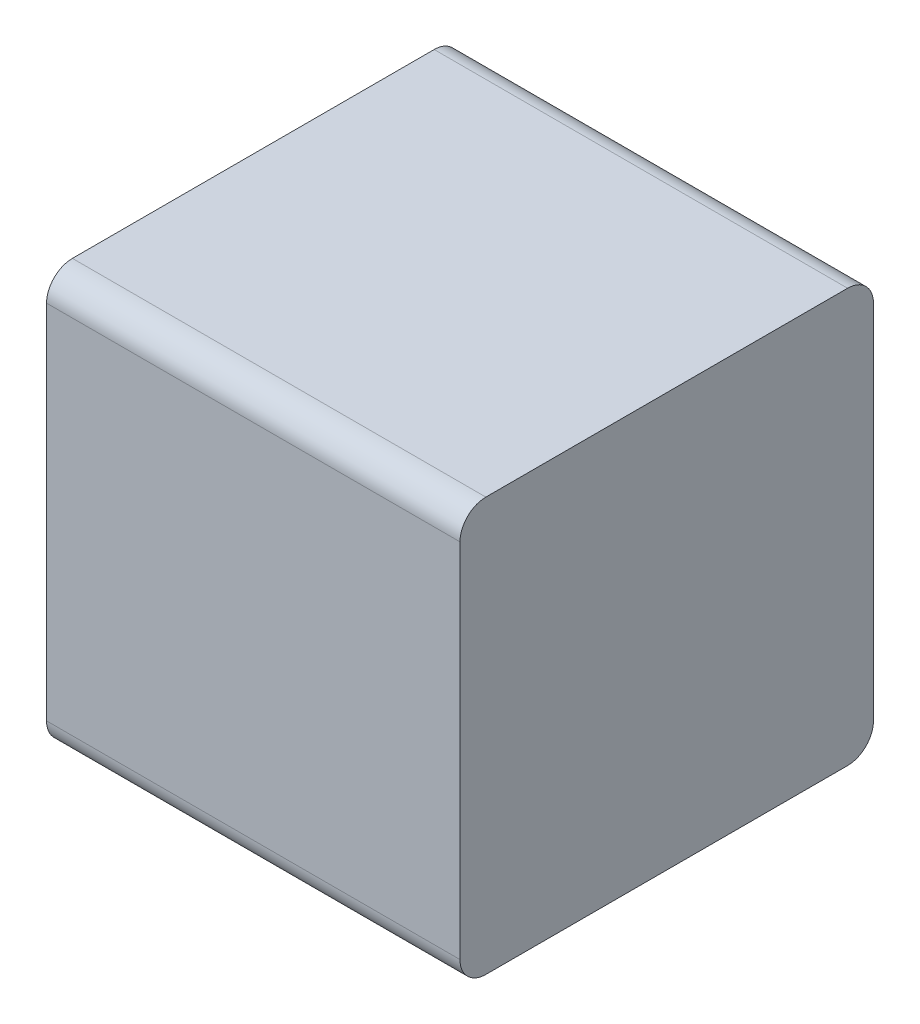
ISO-10303-21;
HEADER;
FILE_DESCRIPTION(('STEP AP214'),'2;1');
FILE_NAME('part.step','',(''),(''),'','','');
FILE_SCHEMA(('AUTOMOTIVE_DESIGN { 1 0 10303 214 1 1 1 1 }'));
ENDSEC;
DATA;
#1=APPLICATION_CONTEXT('core data for automotive mechanical design processes');
#2=APPLICATION_PROTOCOL_DEFINITION('international standard','automotive_design',2000,#1);
#3=PRODUCT_CONTEXT('',#1,'mechanical');
#4=PRODUCT('Part','Part','',(#3));
#5=PRODUCT_RELATED_PRODUCT_CATEGORY('part','',(#4));
#6=PRODUCT_DEFINITION_FORMATION('','',#4);
#7=PRODUCT_DEFINITION_CONTEXT('part definition',#1,'design');
#8=PRODUCT_DEFINITION('design','',#6,#7);
#9=PRODUCT_DEFINITION_SHAPE('','',#8);
#10=(LENGTH_UNIT() NAMED_UNIT(*) SI_UNIT(.MILLI.,.METRE.));
#11=(NAMED_UNIT(*) PLANE_ANGLE_UNIT() SI_UNIT($,.RADIAN.));
#12=(NAMED_UNIT(*) SI_UNIT($,.STERADIAN.) SOLID_ANGLE_UNIT());
#13=UNCERTAINTY_MEASURE_WITH_UNIT(LENGTH_MEASURE(1.E-05),#10,'distance_accuracy_value','');
#14=(GEOMETRIC_REPRESENTATION_CONTEXT(3) GLOBAL_UNCERTAINTY_ASSIGNED_CONTEXT((#13)) GLOBAL_UNIT_ASSIGNED_CONTEXT((#10,
#11,#12)) REPRESENTATION_CONTEXT('',''));
#15=CARTESIAN_POINT('',(0.,0.,0.));
#16=DIRECTION('',(0.,0.,1.));
#17=DIRECTION('',(1.,0.,0.));
#18=AXIS2_PLACEMENT_3D('',#15,#16,#17);
#19=CARTESIAN_POINT('',(0.,0.,0.));
#20=DIRECTION('',(0.,1.,0.));
#21=DIRECTION('',(1.,0.,0.));
#22=AXIS2_PLACEMENT_3D('',#19,#20,#21);
#23=PLANE('',#22);
#24=DIRECTION('',(0.,0.,1.));
#25=VECTOR('',#24,1.);
#26=CARTESIAN_POINT('',(1.2,0.,0.));
#27=LINE('',#26,#25);
#28=CARTESIAN_POINT('',(1.2,0.,0.05));
#29=VERTEX_POINT('',#28);
#30=CARTESIAN_POINT('',(1.2,0.,0.75));
#31=VERTEX_POINT('',#30);
#32=EDGE_CURVE('E11',#29,#31,#27,.T.);
#33=ORIENTED_EDGE('',*,*,#32,.T.);
#34=DIRECTION('',(1.,0.,0.));
#35=VECTOR('',#34,1.);
#36=CARTESIAN_POINT('',(0.,0.,0.75));
#37=LINE('',#36,#35);
#38=CARTESIAN_POINT('',(0.4,0.,0.75));
#39=VERTEX_POINT('',#38);
#40=EDGE_CURVE('E42',#39,#31,#37,.T.);
#41=ORIENTED_EDGE('',*,*,#40,.F.);
#42=DIRECTION('',(0.,0.,1.));
#43=VECTOR('',#42,1.);
#44=CARTESIAN_POINT('',(0.4,0.,0.));
#45=LINE('',#44,#43);
#46=CARTESIAN_POINT('',(0.4,0.,0.05));
#47=VERTEX_POINT('',#46);
#48=EDGE_CURVE('E156',#47,#39,#45,.T.);
#49=ORIENTED_EDGE('',*,*,#48,.F.);
#50=DIRECTION('',(1.,0.,0.));
#51=VECTOR('',#50,1.);
#52=CARTESIAN_POINT('',(0.,0.,0.05));
#53=LINE('',#52,#51);
#54=EDGE_CURVE('E28',#47,#29,#53,.T.);
#55=ORIENTED_EDGE('',*,*,#54,.T.);
#56=EDGE_LOOP('',(#33,#41,#49,#55));
#57=FACE_BOUND('',#56,.T.);
#58=ADVANCED_FACE('F17',(#57),#23,.F.);
#59=CARTESIAN_POINT('',(0.,0.05,0.05));
#60=DIRECTION('',(1.,0.,0.));
#61=DIRECTION('',(0.,-1.,0.));
#62=AXIS2_PLACEMENT_3D('',#59,#60,#61);
#63=CYLINDRICAL_SURFACE('',#62,0.05);
#64=ORIENTED_EDGE('',*,*,#54,.F.);
#65=CARTESIAN_POINT('',(0.4,0.05,0.05));
#66=DIRECTION('',(1.,0.,0.));
#67=DIRECTION('',(0.,-1.,0.));
#68=AXIS2_PLACEMENT_3D('',#65,#66,#67);
#69=CIRCLE('',#68,0.05);
#70=CARTESIAN_POINT('',(0.4,0.05,0.));
#71=VERTEX_POINT('',#70);
#72=EDGE_CURVE('E151',#47,#71,#69,.T.);
#73=ORIENTED_EDGE('',*,*,#72,.T.);
#74=DIRECTION('',(1.,0.,0.));
#75=VECTOR('',#74,1.);
#76=CARTESIAN_POINT('',(0.,0.05,0.));
#77=LINE('',#76,#75);
#78=CARTESIAN_POINT('',(1.2,0.05,0.));
#79=VERTEX_POINT('',#78);
#80=EDGE_CURVE('E168',#71,#79,#77,.T.);
#81=ORIENTED_EDGE('',*,*,#80,.T.);
#82=CARTESIAN_POINT('',(1.2,0.05,0.05));
#83=DIRECTION('',(1.,0.,0.));
#84=DIRECTION('',(0.,-1.,0.));
#85=AXIS2_PLACEMENT_3D('',#82,#83,#84);
#86=CIRCLE('',#85,0.05);
#87=EDGE_CURVE('E147',#29,#79,#86,.T.);
#88=ORIENTED_EDGE('',*,*,#87,.F.);
#89=EDGE_LOOP('',(#64,#73,#81,#88));
#90=FACE_BOUND('',#89,.T.);
#91=ADVANCED_FACE('F199',(#90),#63,.T.);
#92=CARTESIAN_POINT('',(1.2,0.,0.));
#93=DIRECTION('',(1.,0.,0.));
#94=DIRECTION('',(0.,1.,0.));
#95=AXIS2_PLACEMENT_3D('',#92,#93,#94);
#96=PLANE('',#95);
#97=ORIENTED_EDGE('',*,*,#32,.F.);
#98=ORIENTED_EDGE('',*,*,#87,.T.);
#99=DIRECTION('',(0.,1.,0.));
#100=VECTOR('',#99,1.);
#101=CARTESIAN_POINT('',(1.2,0.,0.));
#102=LINE('',#101,#100);
#103=CARTESIAN_POINT('',(1.2,0.75,0.));
#104=VERTEX_POINT('',#103);
#105=EDGE_CURVE('E143',#79,#104,#102,.T.);
#106=ORIENTED_EDGE('',*,*,#105,.T.);
#107=CARTESIAN_POINT('',(1.2,0.75,0.05));
#108=DIRECTION('',(1.,0.,0.));
#109=DIRECTION('',(0.,1.,0.));
#110=AXIS2_PLACEMENT_3D('',#107,#108,#109);
#111=CIRCLE('',#110,0.05);
#112=CARTESIAN_POINT('',(1.2,0.8,0.05));
#113=VERTEX_POINT('',#112);
#114=EDGE_CURVE('E148',#104,#113,#111,.T.);
#115=ORIENTED_EDGE('',*,*,#114,.T.);
#116=DIRECTION('',(0.,0.,1.));
#117=VECTOR('',#116,1.);
#118=CARTESIAN_POINT('',(1.2,0.8,0.));
#119=LINE('',#118,#117);
#120=CARTESIAN_POINT('',(1.2,0.8,0.75));
#121=VERTEX_POINT('',#120);
#122=EDGE_CURVE('E121',#113,#121,#119,.T.);
#123=ORIENTED_EDGE('',*,*,#122,.T.);
#124=CARTESIAN_POINT('',(1.2,0.75,0.75));
#125=DIRECTION('',(1.,0.,0.));
#126=DIRECTION('',(0.,1.,0.));
#127=AXIS2_PLACEMENT_3D('',#124,#125,#126);
#128=CIRCLE('',#127,0.05);
#129=CARTESIAN_POINT('',(1.2,0.75,0.8));
#130=VERTEX_POINT('',#129);
#131=EDGE_CURVE('E117',#121,#130,#128,.T.);
#132=ORIENTED_EDGE('',*,*,#131,.T.);
#133=DIRECTION('',(0.,1.,0.));
#134=VECTOR('',#133,1.);
#135=CARTESIAN_POINT('',(1.2,0.,0.8));
#136=LINE('',#135,#134);
#137=CARTESIAN_POINT('',(1.2,0.05,0.8));
#138=VERTEX_POINT('',#137);
#139=EDGE_CURVE('E108',#138,#130,#136,.T.);
#140=ORIENTED_EDGE('',*,*,#139,.F.);
#141=CARTESIAN_POINT('',(1.2,0.05,0.75));
#142=DIRECTION('',(1.,0.,0.));
#143=DIRECTION('',(0.,-1.,0.));
#144=AXIS2_PLACEMENT_3D('',#141,#142,#143);
#145=CIRCLE('',#144,0.05);
#146=EDGE_CURVE('E124',#138,#31,#145,.T.);
#147=ORIENTED_EDGE('',*,*,#146,.T.);
#148=EDGE_LOOP('',(#97,#98,#106,#115,#123,#132,#140,#147));
#149=FACE_BOUND('',#148,.T.);
#150=ADVANCED_FACE('F119',(#149),#96,.T.);
#151=CARTESIAN_POINT('',(0.,0.05,0.75));
#152=DIRECTION('',(1.,0.,0.));
#153=DIRECTION('',(0.,-1.,0.));
#154=AXIS2_PLACEMENT_3D('',#151,#152,#153);
#155=CYLINDRICAL_SURFACE('',#154,0.05);
#156=ORIENTED_EDGE('',*,*,#40,.T.);
#157=ORIENTED_EDGE('',*,*,#146,.F.);
#158=DIRECTION('',(1.,0.,0.));
#159=VECTOR('',#158,1.);
#160=CARTESIAN_POINT('',(0.,0.05,0.8));
#161=LINE('',#160,#159);
#162=CARTESIAN_POINT('',(0.4,0.05,0.8));
#163=VERTEX_POINT('',#162);
#164=EDGE_CURVE('E21',#163,#138,#161,.T.);
#165=ORIENTED_EDGE('',*,*,#164,.F.);
#166=CARTESIAN_POINT('',(0.4,0.05,0.75));
#167=DIRECTION('',(1.,0.,0.));
#168=DIRECTION('',(0.,-1.,0.));
#169=AXIS2_PLACEMENT_3D('',#166,#167,#168);
#170=CIRCLE('',#169,0.05);
#171=EDGE_CURVE('E155',#163,#39,#170,.T.);
#172=ORIENTED_EDGE('',*,*,#171,.T.);
#173=EDGE_LOOP('',(#156,#157,#165,#172));
#174=FACE_BOUND('',#173,.T.);
#175=ADVANCED_FACE('F210',(#174),#155,.T.);
#176=CARTESIAN_POINT('',(0.4,0.,0.));
#177=DIRECTION('',(1.,0.,0.));
#178=DIRECTION('',(0.,1.,0.));
#179=AXIS2_PLACEMENT_3D('',#176,#177,#178);
#180=PLANE('',#179);
#181=ORIENTED_EDGE('',*,*,#171,.F.);
#182=DIRECTION('',(0.,1.,0.));
#183=VECTOR('',#182,1.);
#184=CARTESIAN_POINT('',(0.4,0.,0.8));
#185=LINE('',#184,#183);
#186=CARTESIAN_POINT('',(0.4,0.75,0.8));
#187=VERTEX_POINT('',#186);
#188=EDGE_CURVE('E152',#163,#187,#185,.T.);
#189=ORIENTED_EDGE('',*,*,#188,.T.);
#190=CARTESIAN_POINT('',(0.4,0.75,0.75));
#191=DIRECTION('',(1.,0.,0.));
#192=DIRECTION('',(0.,1.,0.));
#193=AXIS2_PLACEMENT_3D('',#190,#191,#192);
#194=CIRCLE('',#193,0.05);
#195=CARTESIAN_POINT('',(0.4,0.8,0.75));
#196=VERTEX_POINT('',#195);
#197=EDGE_CURVE('E95',#196,#187,#194,.T.);
#198=ORIENTED_EDGE('',*,*,#197,.F.);
#199=DIRECTION('',(0.,0.,1.));
#200=VECTOR('',#199,1.);
#201=CARTESIAN_POINT('',(0.4,0.8,0.));
#202=LINE('',#201,#200);
#203=CARTESIAN_POINT('',(0.4,0.8,0.05));
#204=VERTEX_POINT('',#203);
#205=EDGE_CURVE('E128',#204,#196,#202,.T.);
#206=ORIENTED_EDGE('',*,*,#205,.F.);
#207=CARTESIAN_POINT('',(0.4,0.75,0.05));
#208=DIRECTION('',(1.,0.,0.));
#209=DIRECTION('',(0.,1.,0.));
#210=AXIS2_PLACEMENT_3D('',#207,#208,#209);
#211=CIRCLE('',#210,0.05);
#212=CARTESIAN_POINT('',(0.4,0.75,0.));
#213=VERTEX_POINT('',#212);
#214=EDGE_CURVE('E157',#213,#204,#211,.T.);
#215=ORIENTED_EDGE('',*,*,#214,.F.);
#216=DIRECTION('',(0.,1.,0.));
#217=VECTOR('',#216,1.);
#218=CARTESIAN_POINT('',(0.4,0.,0.));
#219=LINE('',#218,#217);
#220=EDGE_CURVE('E189',#71,#213,#219,.T.);
#221=ORIENTED_EDGE('',*,*,#220,.F.);
#222=ORIENTED_EDGE('',*,*,#72,.F.);
#223=ORIENTED_EDGE('',*,*,#48,.T.);
#224=EDGE_LOOP('',(#181,#189,#198,#206,#215,#221,#222,#223));
#225=FACE_BOUND('',#224,.T.);
#226=ADVANCED_FACE('F212',(#225),#180,.F.);
#227=CARTESIAN_POINT('',(0.,0.,0.));
#228=DIRECTION('',(0.,0.,1.));
#229=DIRECTION('',(1.,0.,0.));
#230=AXIS2_PLACEMENT_3D('',#227,#228,#229);
#231=PLANE('',#230);
#232=DIRECTION('',(1.,0.,0.));
#233=VECTOR('',#232,1.);
#234=CARTESIAN_POINT('',(0.,0.75,0.));
#235=LINE('',#234,#233);
#236=EDGE_CURVE('E165',#213,#104,#235,.T.);
#237=ORIENTED_EDGE('',*,*,#236,.T.);
#238=ORIENTED_EDGE('',*,*,#105,.F.);
#239=ORIENTED_EDGE('',*,*,#80,.F.);
#240=ORIENTED_EDGE('',*,*,#220,.T.);
#241=EDGE_LOOP('',(#237,#238,#239,#240));
#242=FACE_BOUND('',#241,.T.);
#243=ADVANCED_FACE('F204',(#242),#231,.F.);
#244=CARTESIAN_POINT('',(0.,0.,0.8));
#245=DIRECTION('',(0.,0.,1.));
#246=DIRECTION('',(1.,0.,0.));
#247=AXIS2_PLACEMENT_3D('',#244,#245,#246);
#248=PLANE('',#247);
#249=ORIENTED_EDGE('',*,*,#188,.F.);
#250=ORIENTED_EDGE('',*,*,#164,.T.);
#251=ORIENTED_EDGE('',*,*,#139,.T.);
#252=DIRECTION('',(1.,0.,0.));
#253=VECTOR('',#252,1.);
#254=CARTESIAN_POINT('',(0.,0.75,0.8));
#255=LINE('',#254,#253);
#256=EDGE_CURVE('E111',#187,#130,#255,.T.);
#257=ORIENTED_EDGE('',*,*,#256,.F.);
#258=EDGE_LOOP('',(#249,#250,#251,#257));
#259=FACE_BOUND('',#258,.T.);
#260=ADVANCED_FACE('F19',(#259),#248,.T.);
#261=CARTESIAN_POINT('',(0.,0.75,0.75));
#262=DIRECTION('',(1.,0.,0.));
#263=DIRECTION('',(0.,1.,0.));
#264=AXIS2_PLACEMENT_3D('',#261,#262,#263);
#265=CYLINDRICAL_SURFACE('',#264,0.05);
#266=DIRECTION('',(1.,0.,0.));
#267=VECTOR('',#266,1.);
#268=CARTESIAN_POINT('',(0.,0.8,0.75));
#269=LINE('',#268,#267);
#270=EDGE_CURVE('E136',#196,#121,#269,.T.);
#271=ORIENTED_EDGE('',*,*,#270,.F.);
#272=ORIENTED_EDGE('',*,*,#197,.T.);
#273=ORIENTED_EDGE('',*,*,#256,.T.);
#274=ORIENTED_EDGE('',*,*,#131,.F.);
#275=EDGE_LOOP('',(#271,#272,#273,#274));
#276=FACE_BOUND('',#275,.T.);
#277=ADVANCED_FACE('F126',(#276),#265,.T.);
#278=CARTESIAN_POINT('',(0.,0.8,0.));
#279=DIRECTION('',(0.,1.,0.));
#280=DIRECTION('',(1.,0.,0.));
#281=AXIS2_PLACEMENT_3D('',#278,#279,#280);
#282=PLANE('',#281);
#283=DIRECTION('',(1.,0.,0.));
#284=VECTOR('',#283,1.);
#285=CARTESIAN_POINT('',(0.,0.8,0.05));
#286=LINE('',#285,#284);
#287=EDGE_CURVE('E142',#204,#113,#286,.T.);
#288=ORIENTED_EDGE('',*,*,#287,.F.);
#289=ORIENTED_EDGE('',*,*,#205,.T.);
#290=ORIENTED_EDGE('',*,*,#270,.T.);
#291=ORIENTED_EDGE('',*,*,#122,.F.);
#292=EDGE_LOOP('',(#288,#289,#290,#291));
#293=FACE_BOUND('',#292,.T.);
#294=ADVANCED_FACE('F224',(#293),#282,.T.);
#295=CARTESIAN_POINT('',(0.,0.75,0.05));
#296=DIRECTION('',(1.,0.,0.));
#297=DIRECTION('',(0.,1.,0.));
#298=AXIS2_PLACEMENT_3D('',#295,#296,#297);
#299=CYLINDRICAL_SURFACE('',#298,0.05);
#300=ORIENTED_EDGE('',*,*,#287,.T.);
#301=ORIENTED_EDGE('',*,*,#114,.F.);
#302=ORIENTED_EDGE('',*,*,#236,.F.);
#303=ORIENTED_EDGE('',*,*,#214,.T.);
#304=EDGE_LOOP('',(#300,#301,#302,#303));
#305=FACE_BOUND('',#304,.T.);
#306=ADVANCED_FACE('F179',(#305),#299,.T.);
#307=CLOSED_SHELL('',(#58,#91,#150,#175,#226,#243,#260,#277,#294,#306));
#308=MANIFOLD_SOLID_BREP('B1',#307);
#309=ADVANCED_BREP_SHAPE_REPRESENTATION('',(#18,#308),#14);
#310=SHAPE_DEFINITION_REPRESENTATION(#9,#309);
ENDSEC;
END-ISO-10303-21;
